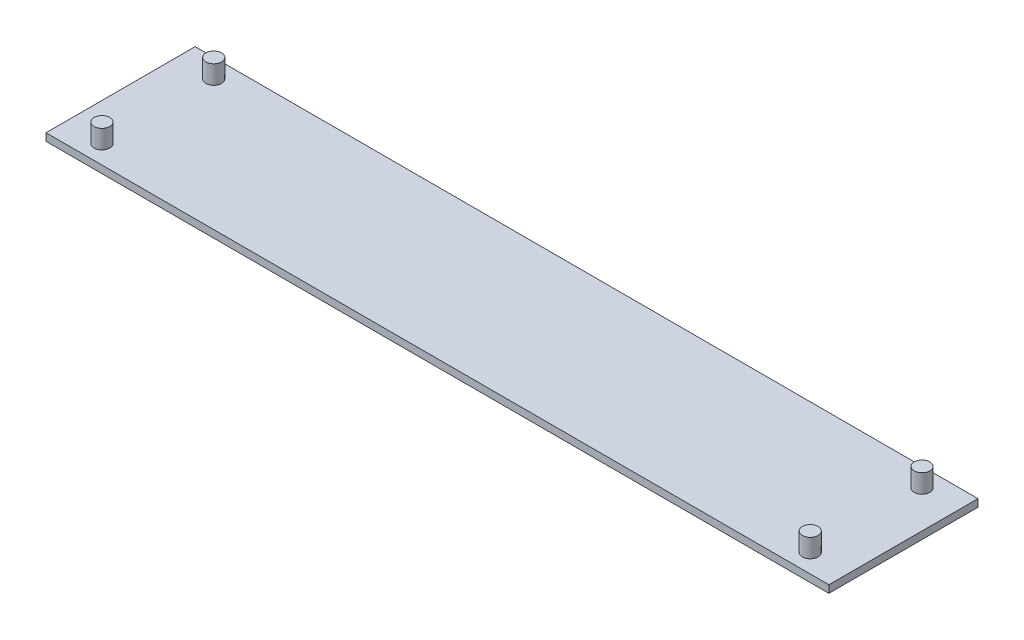
ISO-10303-21;
HEADER;
FILE_DESCRIPTION(('STEP AP214'),'2;1');
FILE_NAME('part.step','',(''),(''),'','','');
FILE_SCHEMA(('AUTOMOTIVE_DESIGN { 1 0 10303 214 1 1 1 1 }'));
ENDSEC;
DATA;
#1=APPLICATION_CONTEXT('core data for automotive mechanical design processes');
#2=APPLICATION_PROTOCOL_DEFINITION('international standard','automotive_design',2000,#1);
#3=PRODUCT_CONTEXT('',#1,'mechanical');
#4=PRODUCT('Part','Part','',(#3));
#5=PRODUCT_RELATED_PRODUCT_CATEGORY('part','',(#4));
#6=PRODUCT_DEFINITION_FORMATION('','',#4);
#7=PRODUCT_DEFINITION_CONTEXT('part definition',#1,'design');
#8=PRODUCT_DEFINITION('design','',#6,#7);
#9=PRODUCT_DEFINITION_SHAPE('','',#8);
#10=(LENGTH_UNIT() NAMED_UNIT(*) SI_UNIT(.MILLI.,.METRE.));
#11=(NAMED_UNIT(*) PLANE_ANGLE_UNIT() SI_UNIT($,.RADIAN.));
#12=(NAMED_UNIT(*) SI_UNIT($,.STERADIAN.) SOLID_ANGLE_UNIT());
#13=UNCERTAINTY_MEASURE_WITH_UNIT(LENGTH_MEASURE(1.E-05),#10,'distance_accuracy_value','');
#14=(GEOMETRIC_REPRESENTATION_CONTEXT(3) GLOBAL_UNCERTAINTY_ASSIGNED_CONTEXT((#13)) GLOBAL_UNIT_ASSIGNED_CONTEXT((#10,
#11,#12)) REPRESENTATION_CONTEXT('',''));
#15=CARTESIAN_POINT('',(0.,0.,0.));
#16=DIRECTION('',(0.,0.,1.));
#17=DIRECTION('',(1.,0.,0.));
#18=AXIS2_PLACEMENT_3D('',#15,#16,#17);
#19=CARTESIAN_POINT('',(105.,2.,-20.));
#20=DIRECTION('',(-1.,0.,0.));
#21=DIRECTION('',(0.,0.,1.));
#22=AXIS2_PLACEMENT_3D('',#19,#20,#21);
#23=PLANE('',#22);
#24=DIRECTION('',(0.,0.,-1.));
#25=VECTOR('',#24,1.);
#26=CARTESIAN_POINT('',(105.,0.,-20.));
#27=LINE('',#26,#25);
#28=CARTESIAN_POINT('',(105.,0.,20.));
#29=VERTEX_POINT('',#28);
#30=CARTESIAN_POINT('',(105.,0.,-20.));
#31=VERTEX_POINT('',#30);
#32=EDGE_CURVE('E98',#29,#31,#27,.T.);
#33=ORIENTED_EDGE('',*,*,#32,.T.);
#34=DIRECTION('',(0.,-1.,0.));
#35=VECTOR('',#34,1.);
#36=CARTESIAN_POINT('',(105.,2.,-20.));
#37=LINE('',#36,#35);
#38=CARTESIAN_POINT('',(105.,2.,-20.));
#39=VERTEX_POINT('',#38);
#40=EDGE_CURVE('E11',#39,#31,#37,.T.);
#41=ORIENTED_EDGE('',*,*,#40,.F.);
#42=DIRECTION('',(0.,0.,-1.));
#43=VECTOR('',#42,1.);
#44=CARTESIAN_POINT('',(105.,2.,-20.));
#45=LINE('',#44,#43);
#46=CARTESIAN_POINT('',(105.,2.,20.));
#47=VERTEX_POINT('',#46);
#48=EDGE_CURVE('E86',#47,#39,#45,.T.);
#49=ORIENTED_EDGE('',*,*,#48,.F.);
#50=DIRECTION('',(0.,-1.,0.));
#51=VECTOR('',#50,1.);
#52=CARTESIAN_POINT('',(105.,2.,20.));
#53=LINE('',#52,#51);
#54=EDGE_CURVE('E94',#47,#29,#53,.T.);
#55=ORIENTED_EDGE('',*,*,#54,.T.);
#56=EDGE_LOOP('',(#33,#41,#49,#55));
#57=FACE_BOUND('',#56,.T.);
#58=ADVANCED_FACE('F35',(#57),#23,.F.);
#59=CARTESIAN_POINT('',(-105.,2.,-20.));
#60=DIRECTION('',(0.,0.,1.));
#61=DIRECTION('',(1.,0.,0.));
#62=AXIS2_PLACEMENT_3D('',#59,#60,#61);
#63=PLANE('',#62);
#64=DIRECTION('',(-1.,0.,0.));
#65=VECTOR('',#64,1.);
#66=CARTESIAN_POINT('',(-105.,0.,-20.));
#67=LINE('',#66,#65);
#68=CARTESIAN_POINT('',(-105.,0.,-20.));
#69=VERTEX_POINT('',#68);
#70=EDGE_CURVE('E90',#31,#69,#67,.T.);
#71=ORIENTED_EDGE('',*,*,#70,.T.);
#72=DIRECTION('',(0.,-1.,0.));
#73=VECTOR('',#72,1.);
#74=CARTESIAN_POINT('',(-105.,2.,-20.));
#75=LINE('',#74,#73);
#76=CARTESIAN_POINT('',(-105.,2.,-20.));
#77=VERTEX_POINT('',#76);
#78=EDGE_CURVE('E43',#77,#69,#75,.T.);
#79=ORIENTED_EDGE('',*,*,#78,.F.);
#80=DIRECTION('',(-1.,0.,0.));
#81=VECTOR('',#80,1.);
#82=CARTESIAN_POINT('',(-105.,2.,-20.));
#83=LINE('',#82,#81);
#84=EDGE_CURVE('E81',#39,#77,#83,.T.);
#85=ORIENTED_EDGE('',*,*,#84,.F.);
#86=ORIENTED_EDGE('',*,*,#40,.T.);
#87=EDGE_LOOP('',(#71,#79,#85,#86));
#88=FACE_BOUND('',#87,.T.);
#89=ADVANCED_FACE('F89',(#88),#63,.F.);
#90=CARTESIAN_POINT('',(-105.,2.,-20.));
#91=DIRECTION('',(1.,0.,0.));
#92=DIRECTION('',(0.,0.,-1.));
#93=AXIS2_PLACEMENT_3D('',#90,#91,#92);
#94=PLANE('',#93);
#95=DIRECTION('',(0.,0.,1.));
#96=VECTOR('',#95,1.);
#97=CARTESIAN_POINT('',(-105.,0.,-20.));
#98=LINE('',#97,#96);
#99=CARTESIAN_POINT('',(-105.,0.,20.));
#100=VERTEX_POINT('',#99);
#101=EDGE_CURVE('E68',#69,#100,#98,.T.);
#102=ORIENTED_EDGE('',*,*,#101,.T.);
#103=DIRECTION('',(0.,-1.,0.));
#104=VECTOR('',#103,1.);
#105=CARTESIAN_POINT('',(-105.,2.,20.));
#106=LINE('',#105,#104);
#107=CARTESIAN_POINT('',(-105.,2.,20.));
#108=VERTEX_POINT('',#107);
#109=EDGE_CURVE('E91',#108,#100,#106,.T.);
#110=ORIENTED_EDGE('',*,*,#109,.F.);
#111=DIRECTION('',(0.,0.,1.));
#112=VECTOR('',#111,1.);
#113=CARTESIAN_POINT('',(-105.,2.,-20.));
#114=LINE('',#113,#112);
#115=EDGE_CURVE('E84',#77,#108,#114,.T.);
#116=ORIENTED_EDGE('',*,*,#115,.F.);
#117=ORIENTED_EDGE('',*,*,#78,.T.);
#118=EDGE_LOOP('',(#102,#110,#116,#117));
#119=FACE_BOUND('',#118,.T.);
#120=ADVANCED_FACE('F92',(#119),#94,.F.);
#121=CARTESIAN_POINT('',(-105.,2.,20.));
#122=DIRECTION('',(0.,0.,-1.));
#123=DIRECTION('',(-1.,0.,0.));
#124=AXIS2_PLACEMENT_3D('',#121,#122,#123);
#125=PLANE('',#124);
#126=DIRECTION('',(1.,0.,0.));
#127=VECTOR('',#126,1.);
#128=CARTESIAN_POINT('',(-105.,0.,20.));
#129=LINE('',#128,#127);
#130=EDGE_CURVE('E74',#100,#29,#129,.T.);
#131=ORIENTED_EDGE('',*,*,#130,.T.);
#132=ORIENTED_EDGE('',*,*,#54,.F.);
#133=DIRECTION('',(1.,0.,0.));
#134=VECTOR('',#133,1.);
#135=CARTESIAN_POINT('',(-105.,2.,20.));
#136=LINE('',#135,#134);
#137=EDGE_CURVE('E51',#108,#47,#136,.T.);
#138=ORIENTED_EDGE('',*,*,#137,.F.);
#139=ORIENTED_EDGE('',*,*,#109,.T.);
#140=EDGE_LOOP('',(#131,#132,#138,#139));
#141=FACE_BOUND('',#140,.T.);
#142=ADVANCED_FACE('F106',(#141),#125,.F.);
#143=CARTESIAN_POINT('',(0.,2.,0.));
#144=DIRECTION('',(0.,1.,0.));
#145=DIRECTION('',(0.,0.,1.));
#146=AXIS2_PLACEMENT_3D('',#143,#144,#145);
#147=PLANE('',#146);
#148=CARTESIAN_POINT('',(-94.9999999999999,2.,15.));
#149=DIRECTION('',(0.,1.,0.));
#150=DIRECTION('',(0.,0.,1.));
#151=AXIS2_PLACEMENT_3D('',#148,#149,#150);
#152=CIRCLE('',#151,2.1);
#153=CARTESIAN_POINT('',(-94.9999999999999,2.,17.1));
#154=VERTEX_POINT('',#153);
#155=EDGE_CURVE('E130',#154,#154,#152,.T.);
#156=ORIENTED_EDGE('',*,*,#155,.F.);
#157=EDGE_LOOP('',(#156));
#158=FACE_BOUND('',#157,.T.);
#159=CARTESIAN_POINT('',(-94.9999999999999,2.,-15.));
#160=DIRECTION('',(0.,1.,0.));
#161=DIRECTION('',(0.,0.,1.));
#162=AXIS2_PLACEMENT_3D('',#159,#160,#161);
#163=CIRCLE('',#162,2.1);
#164=CARTESIAN_POINT('',(-94.9999999999999,2.,-12.9));
#165=VERTEX_POINT('',#164);
#166=EDGE_CURVE('E124',#165,#165,#163,.T.);
#167=ORIENTED_EDGE('',*,*,#166,.F.);
#168=EDGE_LOOP('',(#167));
#169=FACE_BOUND('',#168,.T.);
#170=CARTESIAN_POINT('',(95.,2.,-15.));
#171=DIRECTION('',(0.,1.,0.));
#172=DIRECTION('',(0.,0.,1.));
#173=AXIS2_PLACEMENT_3D('',#170,#171,#172);
#174=CIRCLE('',#173,2.1);
#175=CARTESIAN_POINT('',(95.,2.,-12.9));
#176=VERTEX_POINT('',#175);
#177=EDGE_CURVE('E118',#176,#176,#174,.T.);
#178=ORIENTED_EDGE('',*,*,#177,.F.);
#179=EDGE_LOOP('',(#178));
#180=FACE_BOUND('',#179,.T.);
#181=CARTESIAN_POINT('',(95.,2.,15.));
#182=DIRECTION('',(0.,1.,0.));
#183=DIRECTION('',(0.,0.,1.));
#184=AXIS2_PLACEMENT_3D('',#181,#182,#183);
#185=CIRCLE('',#184,2.1);
#186=CARTESIAN_POINT('',(95.,2.,17.1));
#187=VERTEX_POINT('',#186);
#188=EDGE_CURVE('E112',#187,#187,#185,.T.);
#189=ORIENTED_EDGE('',*,*,#188,.F.);
#190=EDGE_LOOP('',(#189));
#191=FACE_BOUND('',#190,.T.);
#192=ORIENTED_EDGE('',*,*,#48,.T.);
#193=ORIENTED_EDGE('',*,*,#84,.T.);
#194=ORIENTED_EDGE('',*,*,#115,.T.);
#195=ORIENTED_EDGE('',*,*,#137,.T.);
#196=EDGE_LOOP('',(#192,#193,#194,#195));
#197=FACE_BOUND('',#196,.T.);
#198=ADVANCED_FACE('F82',(#158,#169,#180,#191,#197),#147,.T.);
#199=CARTESIAN_POINT('',(0.,0.,0.));
#200=DIRECTION('',(0.,1.,0.));
#201=DIRECTION('',(0.,0.,1.));
#202=AXIS2_PLACEMENT_3D('',#199,#200,#201);
#203=PLANE('',#202);
#204=ORIENTED_EDGE('',*,*,#32,.F.);
#205=ORIENTED_EDGE('',*,*,#130,.F.);
#206=ORIENTED_EDGE('',*,*,#101,.F.);
#207=ORIENTED_EDGE('',*,*,#70,.F.);
#208=EDGE_LOOP('',(#204,#205,#206,#207));
#209=FACE_BOUND('',#208,.T.);
#210=ADVANCED_FACE('F109',(#209),#203,.F.);
#211=CARTESIAN_POINT('',(95.,7.,15.));
#212=DIRECTION('',(0.,-1.,0.));
#213=DIRECTION('',(0.,0.,-1.));
#214=AXIS2_PLACEMENT_3D('',#211,#212,#213);
#215=CYLINDRICAL_SURFACE('',#214,2.1);
#216=CARTESIAN_POINT('',(95.,7.,15.));
#217=DIRECTION('',(0.,1.,0.));
#218=DIRECTION('',(0.,0.,1.));
#219=AXIS2_PLACEMENT_3D('',#216,#217,#218);
#220=CIRCLE('',#219,2.1);
#221=CARTESIAN_POINT('',(95.,7.,17.1));
#222=VERTEX_POINT('',#221);
#223=EDGE_CURVE('E101',#222,#222,#220,.T.);
#224=ORIENTED_EDGE('',*,*,#223,.F.);
#225=EDGE_LOOP('',(#224));
#226=FACE_BOUND('',#225,.T.);
#227=ORIENTED_EDGE('',*,*,#188,.T.);
#228=EDGE_LOOP('',(#227));
#229=FACE_BOUND('',#228,.T.);
#230=ADVANCED_FACE('F154',(#226,#229),#215,.T.);
#231=CARTESIAN_POINT('',(95.,7.,15.));
#232=DIRECTION('',(0.,1.,0.));
#233=DIRECTION('',(0.,0.,1.));
#234=AXIS2_PLACEMENT_3D('',#231,#232,#233);
#235=PLANE('',#234);
#236=ORIENTED_EDGE('',*,*,#223,.T.);
#237=EDGE_LOOP('',(#236));
#238=FACE_BOUND('',#237,.T.);
#239=ADVANCED_FACE('F156',(#238),#235,.T.);
#240=CARTESIAN_POINT('',(95.,7.,-15.));
#241=DIRECTION('',(0.,-1.,0.));
#242=DIRECTION('',(0.,0.,-1.));
#243=AXIS2_PLACEMENT_3D('',#240,#241,#242);
#244=CYLINDRICAL_SURFACE('',#243,2.1);
#245=CARTESIAN_POINT('',(95.,7.,-15.));
#246=DIRECTION('',(0.,1.,0.));
#247=DIRECTION('',(0.,0.,1.));
#248=AXIS2_PLACEMENT_3D('',#245,#246,#247);
#249=CIRCLE('',#248,2.1);
#250=CARTESIAN_POINT('',(95.,7.,-12.9));
#251=VERTEX_POINT('',#250);
#252=EDGE_CURVE('E115',#251,#251,#249,.T.);
#253=ORIENTED_EDGE('',*,*,#252,.F.);
#254=EDGE_LOOP('',(#253));
#255=FACE_BOUND('',#254,.T.);
#256=ORIENTED_EDGE('',*,*,#177,.T.);
#257=EDGE_LOOP('',(#256));
#258=FACE_BOUND('',#257,.T.);
#259=ADVANCED_FACE('F163',(#255,#258),#244,.T.);
#260=CARTESIAN_POINT('',(95.,7.,-15.));
#261=DIRECTION('',(0.,1.,0.));
#262=DIRECTION('',(0.,0.,1.));
#263=AXIS2_PLACEMENT_3D('',#260,#261,#262);
#264=PLANE('',#263);
#265=ORIENTED_EDGE('',*,*,#252,.T.);
#266=EDGE_LOOP('',(#265));
#267=FACE_BOUND('',#266,.T.);
#268=ADVANCED_FACE('F211',(#267),#264,.T.);
#269=CARTESIAN_POINT('',(-94.9999999999999,7.,-15.));
#270=DIRECTION('',(0.,-1.,0.));
#271=DIRECTION('',(0.,0.,-1.));
#272=AXIS2_PLACEMENT_3D('',#269,#270,#271);
#273=CYLINDRICAL_SURFACE('',#272,2.1);
#274=CARTESIAN_POINT('',(-94.9999999999999,7.,-15.));
#275=DIRECTION('',(0.,1.,0.));
#276=DIRECTION('',(0.,0.,1.));
#277=AXIS2_PLACEMENT_3D('',#274,#275,#276);
#278=CIRCLE('',#277,2.1);
#279=CARTESIAN_POINT('',(-94.9999999999999,7.,-12.9));
#280=VERTEX_POINT('',#279);
#281=EDGE_CURVE('E121',#280,#280,#278,.T.);
#282=ORIENTED_EDGE('',*,*,#281,.F.);
#283=EDGE_LOOP('',(#282));
#284=FACE_BOUND('',#283,.T.);
#285=ORIENTED_EDGE('',*,*,#166,.T.);
#286=EDGE_LOOP('',(#285));
#287=FACE_BOUND('',#286,.T.);
#288=ADVANCED_FACE('F220',(#284,#287),#273,.T.);
#289=CARTESIAN_POINT('',(-94.9999999999999,7.,-15.));
#290=DIRECTION('',(0.,1.,0.));
#291=DIRECTION('',(0.,0.,1.));
#292=AXIS2_PLACEMENT_3D('',#289,#290,#291);
#293=PLANE('',#292);
#294=ORIENTED_EDGE('',*,*,#281,.T.);
#295=EDGE_LOOP('',(#294));
#296=FACE_BOUND('',#295,.T.);
#297=ADVANCED_FACE('F141',(#296),#293,.T.);
#298=CARTESIAN_POINT('',(-94.9999999999999,7.,15.));
#299=DIRECTION('',(0.,-1.,0.));
#300=DIRECTION('',(0.,0.,-1.));
#301=AXIS2_PLACEMENT_3D('',#298,#299,#300);
#302=CYLINDRICAL_SURFACE('',#301,2.1);
#303=CARTESIAN_POINT('',(-94.9999999999999,7.,15.));
#304=DIRECTION('',(0.,1.,0.));
#305=DIRECTION('',(0.,0.,1.));
#306=AXIS2_PLACEMENT_3D('',#303,#304,#305);
#307=CIRCLE('',#306,2.1);
#308=CARTESIAN_POINT('',(-94.9999999999999,7.,17.1));
#309=VERTEX_POINT('',#308);
#310=EDGE_CURVE('E127',#309,#309,#307,.T.);
#311=ORIENTED_EDGE('',*,*,#310,.F.);
#312=EDGE_LOOP('',(#311));
#313=FACE_BOUND('',#312,.T.);
#314=ORIENTED_EDGE('',*,*,#155,.T.);
#315=EDGE_LOOP('',(#314));
#316=FACE_BOUND('',#315,.T.);
#317=ADVANCED_FACE('F138',(#313,#316),#302,.T.);
#318=CARTESIAN_POINT('',(-94.9999999999999,7.,15.));
#319=DIRECTION('',(0.,1.,0.));
#320=DIRECTION('',(0.,0.,1.));
#321=AXIS2_PLACEMENT_3D('',#318,#319,#320);
#322=PLANE('',#321);
#323=ORIENTED_EDGE('',*,*,#310,.T.);
#324=EDGE_LOOP('',(#323));
#325=FACE_BOUND('',#324,.T.);
#326=ADVANCED_FACE('F136',(#325),#322,.T.);
#327=CLOSED_SHELL('',(#58,#89,#120,#142,#198,#210,#230,#239,#259,#268,#288,#297,#317,#326));
#328=MANIFOLD_SOLID_BREP('B2',#327);
#329=ADVANCED_BREP_SHAPE_REPRESENTATION('',(#18,#328),#14);
#330=SHAPE_DEFINITION_REPRESENTATION(#9,#329);
ENDSEC;
END-ISO-10303-21;
